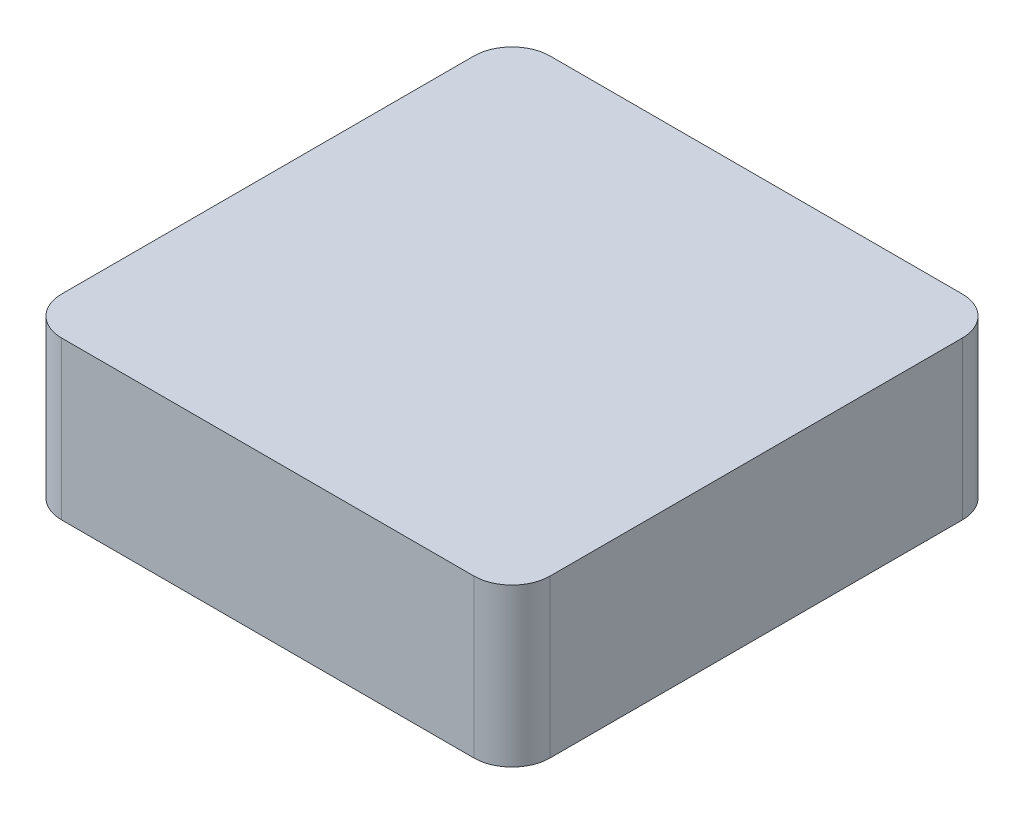
ISO-10303-21;
HEADER;
FILE_DESCRIPTION(('STEP AP214'),'2;1');
FILE_NAME('part.step','',(''),(''),'','','');
FILE_SCHEMA(('AUTOMOTIVE_DESIGN { 1 0 10303 214 1 1 1 1 }'));
ENDSEC;
DATA;
#1=APPLICATION_CONTEXT('core data for automotive mechanical design processes');
#2=APPLICATION_PROTOCOL_DEFINITION('international standard','automotive_design',2000,#1);
#3=PRODUCT_CONTEXT('',#1,'mechanical');
#4=PRODUCT('Part','Part','',(#3));
#5=PRODUCT_RELATED_PRODUCT_CATEGORY('part','',(#4));
#6=PRODUCT_DEFINITION_FORMATION('','',#4);
#7=PRODUCT_DEFINITION_CONTEXT('part definition',#1,'design');
#8=PRODUCT_DEFINITION('design','',#6,#7);
#9=PRODUCT_DEFINITION_SHAPE('','',#8);
#10=(LENGTH_UNIT() NAMED_UNIT(*) SI_UNIT(.MILLI.,.METRE.));
#11=(NAMED_UNIT(*) PLANE_ANGLE_UNIT() SI_UNIT($,.RADIAN.));
#12=(NAMED_UNIT(*) SI_UNIT($,.STERADIAN.) SOLID_ANGLE_UNIT());
#13=UNCERTAINTY_MEASURE_WITH_UNIT(LENGTH_MEASURE(1.E-05),#10,'distance_accuracy_value','');
#14=(GEOMETRIC_REPRESENTATION_CONTEXT(3) GLOBAL_UNCERTAINTY_ASSIGNED_CONTEXT((#13)) GLOBAL_UNIT_ASSIGNED_CONTEXT((#10,
#11,#12)) REPRESENTATION_CONTEXT('',''));
#15=CARTESIAN_POINT('',(0.,0.,0.));
#16=DIRECTION('',(0.,0.,1.));
#17=DIRECTION('',(1.,0.,0.));
#18=AXIS2_PLACEMENT_3D('',#15,#16,#17);
#19=CARTESIAN_POINT('',(64.,20.65,64.));
#20=DIRECTION('',(-1.,0.,0.));
#21=DIRECTION('',(0.,0.,1.));
#22=AXIS2_PLACEMENT_3D('',#19,#20,#21);
#23=PLANE('',#22);
#24=DIRECTION('',(0.,0.,-1.));
#25=VECTOR('',#24,1.);
#26=CARTESIAN_POINT('',(64.,20.65,64.));
#27=LINE('',#26,#25);
#28=CARTESIAN_POINT('',(64.,20.65,54.));
#29=VERTEX_POINT('',#28);
#30=CARTESIAN_POINT('',(64.,20.65,-54.));
#31=VERTEX_POINT('',#30);
#32=EDGE_CURVE('E132',#29,#31,#27,.T.);
#33=ORIENTED_EDGE('',*,*,#32,.F.);
#34=DIRECTION('',(0.,-1.,0.));
#35=VECTOR('',#34,1.);
#36=CARTESIAN_POINT('',(64.,20.65,54.));
#37=LINE('',#36,#35);
#38=CARTESIAN_POINT('',(64.,-20.65,54.));
#39=VERTEX_POINT('',#38);
#40=EDGE_CURVE('E116',#29,#39,#37,.T.);
#41=ORIENTED_EDGE('',*,*,#40,.T.);
#42=DIRECTION('',(0.,0.,-1.));
#43=VECTOR('',#42,1.);
#44=CARTESIAN_POINT('',(64.,-20.65,64.));
#45=LINE('',#44,#43);
#46=CARTESIAN_POINT('',(64.,-20.65,-54.));
#47=VERTEX_POINT('',#46);
#48=EDGE_CURVE('E129',#39,#47,#45,.T.);
#49=ORIENTED_EDGE('',*,*,#48,.T.);
#50=DIRECTION('',(0.,-1.,0.));
#51=VECTOR('',#50,1.);
#52=CARTESIAN_POINT('',(64.,20.65,-54.));
#53=LINE('',#52,#51);
#54=EDGE_CURVE('E135',#47,#31,#53,.F.);
#55=ORIENTED_EDGE('',*,*,#54,.T.);
#56=EDGE_LOOP('',(#33,#41,#49,#55));
#57=FACE_BOUND('',#56,.T.);
#58=ADVANCED_FACE('F45',(#57),#23,.F.);
#59=CARTESIAN_POINT('',(-64.,20.65,-64.));
#60=DIRECTION('',(0.,0.,1.));
#61=DIRECTION('',(1.,0.,0.));
#62=AXIS2_PLACEMENT_3D('',#59,#60,#61);
#63=PLANE('',#62);
#64=DIRECTION('',(-1.,0.,0.));
#65=VECTOR('',#64,1.);
#66=CARTESIAN_POINT('',(-64.,-20.65,-64.));
#67=LINE('',#66,#65);
#68=CARTESIAN_POINT('',(54.,-20.65,-64.));
#69=VERTEX_POINT('',#68);
#70=CARTESIAN_POINT('',(-54.,-20.65,-64.));
#71=VERTEX_POINT('',#70);
#72=EDGE_CURVE('E141',#69,#71,#67,.T.);
#73=ORIENTED_EDGE('',*,*,#72,.T.);
#74=DIRECTION('',(0.,-1.,0.));
#75=VECTOR('',#74,1.);
#76=CARTESIAN_POINT('',(-54.,20.65,-64.));
#77=LINE('',#76,#75);
#78=CARTESIAN_POINT('',(-54.,20.65,-64.));
#79=VERTEX_POINT('',#78);
#80=EDGE_CURVE('E11',#71,#79,#77,.F.);
#81=ORIENTED_EDGE('',*,*,#80,.T.);
#82=DIRECTION('',(-1.,0.,0.));
#83=VECTOR('',#82,1.);
#84=CARTESIAN_POINT('',(-64.,20.65,-64.));
#85=LINE('',#84,#83);
#86=CARTESIAN_POINT('',(54.,20.65,-64.));
#87=VERTEX_POINT('',#86);
#88=EDGE_CURVE('E192',#87,#79,#85,.T.);
#89=ORIENTED_EDGE('',*,*,#88,.F.);
#90=DIRECTION('',(0.,-1.,0.));
#91=VECTOR('',#90,1.);
#92=CARTESIAN_POINT('',(54.,20.65,-64.));
#93=LINE('',#92,#91);
#94=EDGE_CURVE('E54',#87,#69,#93,.T.);
#95=ORIENTED_EDGE('',*,*,#94,.T.);
#96=EDGE_LOOP('',(#73,#81,#89,#95));
#97=FACE_BOUND('',#96,.T.);
#98=ADVANCED_FACE('F190',(#97),#63,.F.);
#99=CARTESIAN_POINT('',(-64.,20.65,64.));
#100=DIRECTION('',(1.,0.,0.));
#101=DIRECTION('',(0.,0.,-1.));
#102=AXIS2_PLACEMENT_3D('',#99,#100,#101);
#103=PLANE('',#102);
#104=DIRECTION('',(0.,0.,1.));
#105=VECTOR('',#104,1.);
#106=CARTESIAN_POINT('',(-64.,20.65,64.));
#107=LINE('',#106,#105);
#108=CARTESIAN_POINT('',(-64.,20.65,-54.));
#109=VERTEX_POINT('',#108);
#110=CARTESIAN_POINT('',(-64.,20.65,54.));
#111=VERTEX_POINT('',#110);
#112=EDGE_CURVE('E200',#109,#111,#107,.T.);
#113=ORIENTED_EDGE('',*,*,#112,.F.);
#114=DIRECTION('',(0.,-1.,0.));
#115=VECTOR('',#114,1.);
#116=CARTESIAN_POINT('',(-64.,20.65,-54.));
#117=LINE('',#116,#115);
#118=CARTESIAN_POINT('',(-64.,-20.65,-54.));
#119=VERTEX_POINT('',#118);
#120=EDGE_CURVE('E182',#109,#119,#117,.T.);
#121=ORIENTED_EDGE('',*,*,#120,.T.);
#122=DIRECTION('',(0.,0.,1.));
#123=VECTOR('',#122,1.);
#124=CARTESIAN_POINT('',(-64.,-20.65,64.));
#125=LINE('',#124,#123);
#126=CARTESIAN_POINT('',(-64.,-20.65,54.));
#127=VERTEX_POINT('',#126);
#128=EDGE_CURVE('E145',#119,#127,#125,.T.);
#129=ORIENTED_EDGE('',*,*,#128,.T.);
#130=DIRECTION('',(0.,-1.,0.));
#131=VECTOR('',#130,1.);
#132=CARTESIAN_POINT('',(-64.,20.65,54.));
#133=LINE('',#132,#131);
#134=EDGE_CURVE('E61',#127,#111,#133,.F.);
#135=ORIENTED_EDGE('',*,*,#134,.T.);
#136=EDGE_LOOP('',(#113,#121,#129,#135));
#137=FACE_BOUND('',#136,.T.);
#138=ADVANCED_FACE('F199',(#137),#103,.F.);
#139=CARTESIAN_POINT('',(-64.,20.65,64.));
#140=DIRECTION('',(0.,0.,-1.));
#141=DIRECTION('',(-1.,0.,0.));
#142=AXIS2_PLACEMENT_3D('',#139,#140,#141);
#143=PLANE('',#142);
#144=DIRECTION('',(1.,0.,0.));
#145=VECTOR('',#144,1.);
#146=CARTESIAN_POINT('',(-64.,-20.65,64.));
#147=LINE('',#146,#145);
#148=CARTESIAN_POINT('',(-54.,-20.65,64.));
#149=VERTEX_POINT('',#148);
#150=CARTESIAN_POINT('',(54.,-20.65,64.));
#151=VERTEX_POINT('',#150);
#152=EDGE_CURVE('E153',#149,#151,#147,.T.);
#153=ORIENTED_EDGE('',*,*,#152,.T.);
#154=DIRECTION('',(0.,-1.,0.));
#155=VECTOR('',#154,1.);
#156=CARTESIAN_POINT('',(54.,20.65,64.));
#157=LINE('',#156,#155);
#158=CARTESIAN_POINT('',(54.,20.65,64.));
#159=VERTEX_POINT('',#158);
#160=EDGE_CURVE('E117',#151,#159,#157,.F.);
#161=ORIENTED_EDGE('',*,*,#160,.T.);
#162=DIRECTION('',(1.,0.,0.));
#163=VECTOR('',#162,1.);
#164=CARTESIAN_POINT('',(-64.,20.65,64.));
#165=LINE('',#164,#163);
#166=CARTESIAN_POINT('',(-54.,20.65,64.));
#167=VERTEX_POINT('',#166);
#168=EDGE_CURVE('E148',#167,#159,#165,.T.);
#169=ORIENTED_EDGE('',*,*,#168,.F.);
#170=DIRECTION('',(0.,-1.,0.));
#171=VECTOR('',#170,1.);
#172=CARTESIAN_POINT('',(-54.,20.65,64.));
#173=LINE('',#172,#171);
#174=EDGE_CURVE('E123',#167,#149,#173,.T.);
#175=ORIENTED_EDGE('',*,*,#174,.T.);
#176=EDGE_LOOP('',(#153,#161,#169,#175));
#177=FACE_BOUND('',#176,.T.);
#178=ADVANCED_FACE('F234',(#177),#143,.F.);
#179=CARTESIAN_POINT('',(0.,20.65,0.));
#180=DIRECTION('',(0.,-1.,0.));
#181=DIRECTION('',(0.,0.,-1.));
#182=AXIS2_PLACEMENT_3D('',#179,#180,#181);
#183=PLANE('',#182);
#184=ORIENTED_EDGE('',*,*,#168,.T.);
#185=CARTESIAN_POINT('',(54.,20.65,54.));
#186=DIRECTION('',(0.,-1.,0.));
#187=DIRECTION('',(0.,0.,-1.));
#188=AXIS2_PLACEMENT_3D('',#185,#186,#187);
#189=CIRCLE('',#188,10.);
#190=EDGE_CURVE('E177',#159,#29,#189,.F.);
#191=ORIENTED_EDGE('',*,*,#190,.T.);
#192=ORIENTED_EDGE('',*,*,#32,.T.);
#193=CARTESIAN_POINT('',(54.,20.65,-54.));
#194=DIRECTION('',(0.,-1.,0.));
#195=DIRECTION('',(0.,0.,-1.));
#196=AXIS2_PLACEMENT_3D('',#193,#194,#195);
#197=CIRCLE('',#196,10.);
#198=EDGE_CURVE('E172',#31,#87,#197,.F.);
#199=ORIENTED_EDGE('',*,*,#198,.T.);
#200=ORIENTED_EDGE('',*,*,#88,.T.);
#201=CARTESIAN_POINT('',(-54.,20.65,-54.));
#202=DIRECTION('',(0.,-1.,0.));
#203=DIRECTION('',(0.,0.,-1.));
#204=AXIS2_PLACEMENT_3D('',#201,#202,#203);
#205=CIRCLE('',#204,10.);
#206=EDGE_CURVE('E68',#79,#109,#205,.F.);
#207=ORIENTED_EDGE('',*,*,#206,.T.);
#208=ORIENTED_EDGE('',*,*,#112,.T.);
#209=CARTESIAN_POINT('',(-54.,20.65,54.));
#210=DIRECTION('',(0.,-1.,0.));
#211=DIRECTION('',(0.,0.,-1.));
#212=AXIS2_PLACEMENT_3D('',#209,#210,#211);
#213=CIRCLE('',#212,10.);
#214=EDGE_CURVE('E169',#111,#167,#213,.F.);
#215=ORIENTED_EDGE('',*,*,#214,.T.);
#216=EDGE_LOOP('',(#184,#191,#192,#199,#200,#207,#208,#215));
#217=FACE_BOUND('',#216,.T.);
#218=ADVANCED_FACE('F209',(#217),#183,.F.);
#219=CARTESIAN_POINT('',(0.,-20.65,0.));
#220=DIRECTION('',(0.,-1.,0.));
#221=DIRECTION('',(0.,0.,-1.));
#222=AXIS2_PLACEMENT_3D('',#219,#220,#221);
#223=PLANE('',#222);
#224=ORIENTED_EDGE('',*,*,#48,.F.);
#225=CARTESIAN_POINT('',(54.,-20.65,54.));
#226=DIRECTION('',(0.,-1.,0.));
#227=DIRECTION('',(0.,0.,-1.));
#228=AXIS2_PLACEMENT_3D('',#225,#226,#227);
#229=CIRCLE('',#228,10.);
#230=EDGE_CURVE('E112',#39,#151,#229,.T.);
#231=ORIENTED_EDGE('',*,*,#230,.T.);
#232=ORIENTED_EDGE('',*,*,#152,.F.);
#233=CARTESIAN_POINT('',(-54.,-20.65,54.));
#234=DIRECTION('',(0.,-1.,0.));
#235=DIRECTION('',(0.,0.,-1.));
#236=AXIS2_PLACEMENT_3D('',#233,#234,#235);
#237=CIRCLE('',#236,10.);
#238=EDGE_CURVE('E134',#149,#127,#237,.T.);
#239=ORIENTED_EDGE('',*,*,#238,.T.);
#240=ORIENTED_EDGE('',*,*,#128,.F.);
#241=CARTESIAN_POINT('',(-54.,-20.65,-54.));
#242=DIRECTION('',(0.,-1.,0.));
#243=DIRECTION('',(0.,0.,-1.));
#244=AXIS2_PLACEMENT_3D('',#241,#242,#243);
#245=CIRCLE('',#244,10.);
#246=EDGE_CURVE('E124',#119,#71,#245,.T.);
#247=ORIENTED_EDGE('',*,*,#246,.T.);
#248=ORIENTED_EDGE('',*,*,#72,.F.);
#249=CARTESIAN_POINT('',(54.,-20.65,-54.));
#250=DIRECTION('',(0.,-1.,0.));
#251=DIRECTION('',(0.,0.,-1.));
#252=AXIS2_PLACEMENT_3D('',#249,#250,#251);
#253=CIRCLE('',#252,10.);
#254=EDGE_CURVE('E139',#69,#47,#253,.T.);
#255=ORIENTED_EDGE('',*,*,#254,.T.);
#256=EDGE_LOOP('',(#224,#231,#232,#239,#240,#247,#248,#255));
#257=FACE_BOUND('',#256,.T.);
#258=ADVANCED_FACE('F137',(#257),#223,.T.);
#259=CARTESIAN_POINT('',(54.,20.65,54.));
#260=DIRECTION('',(0.,-1.,0.));
#261=DIRECTION('',(0.,0.,-1.));
#262=AXIS2_PLACEMENT_3D('',#259,#260,#261);
#263=CYLINDRICAL_SURFACE('',#262,10.);
#264=ORIENTED_EDGE('',*,*,#190,.F.);
#265=ORIENTED_EDGE('',*,*,#160,.F.);
#266=ORIENTED_EDGE('',*,*,#230,.F.);
#267=ORIENTED_EDGE('',*,*,#40,.F.);
#268=EDGE_LOOP('',(#264,#265,#266,#267));
#269=FACE_BOUND('',#268,.T.);
#270=ADVANCED_FACE('F115',(#269),#263,.T.);
#271=CARTESIAN_POINT('',(-54.,20.65,-54.));
#272=DIRECTION('',(0.,-1.,0.));
#273=DIRECTION('',(0.,0.,-1.));
#274=AXIS2_PLACEMENT_3D('',#271,#272,#273);
#275=CYLINDRICAL_SURFACE('',#274,10.);
#276=ORIENTED_EDGE('',*,*,#206,.F.);
#277=ORIENTED_EDGE('',*,*,#80,.F.);
#278=ORIENTED_EDGE('',*,*,#246,.F.);
#279=ORIENTED_EDGE('',*,*,#120,.F.);
#280=EDGE_LOOP('',(#276,#277,#278,#279));
#281=FACE_BOUND('',#280,.T.);
#282=ADVANCED_FACE('F198',(#281),#275,.T.);
#283=CARTESIAN_POINT('',(54.,20.65,-54.));
#284=DIRECTION('',(0.,-1.,0.));
#285=DIRECTION('',(0.,0.,-1.));
#286=AXIS2_PLACEMENT_3D('',#283,#284,#285);
#287=CYLINDRICAL_SURFACE('',#286,10.);
#288=ORIENTED_EDGE('',*,*,#198,.F.);
#289=ORIENTED_EDGE('',*,*,#54,.F.);
#290=ORIENTED_EDGE('',*,*,#254,.F.);
#291=ORIENTED_EDGE('',*,*,#94,.F.);
#292=EDGE_LOOP('',(#288,#289,#290,#291));
#293=FACE_BOUND('',#292,.T.);
#294=ADVANCED_FACE('F210',(#293),#287,.T.);
#295=CARTESIAN_POINT('',(-54.,20.65,54.));
#296=DIRECTION('',(0.,-1.,0.));
#297=DIRECTION('',(0.,0.,-1.));
#298=AXIS2_PLACEMENT_3D('',#295,#296,#297);
#299=CYLINDRICAL_SURFACE('',#298,10.);
#300=ORIENTED_EDGE('',*,*,#214,.F.);
#301=ORIENTED_EDGE('',*,*,#134,.F.);
#302=ORIENTED_EDGE('',*,*,#238,.F.);
#303=ORIENTED_EDGE('',*,*,#174,.F.);
#304=EDGE_LOOP('',(#300,#301,#302,#303));
#305=FACE_BOUND('',#304,.T.);
#306=ADVANCED_FACE('F47',(#305),#299,.T.);
#307=CLOSED_SHELL('',(#58,#98,#138,#178,#218,#258,#270,#282,#294,#306));
#308=MANIFOLD_SOLID_BREP('B2',#307);
#309=ADVANCED_BREP_SHAPE_REPRESENTATION('',(#18,#308),#14);
#310=SHAPE_DEFINITION_REPRESENTATION(#9,#309);
ENDSEC;
END-ISO-10303-21;
